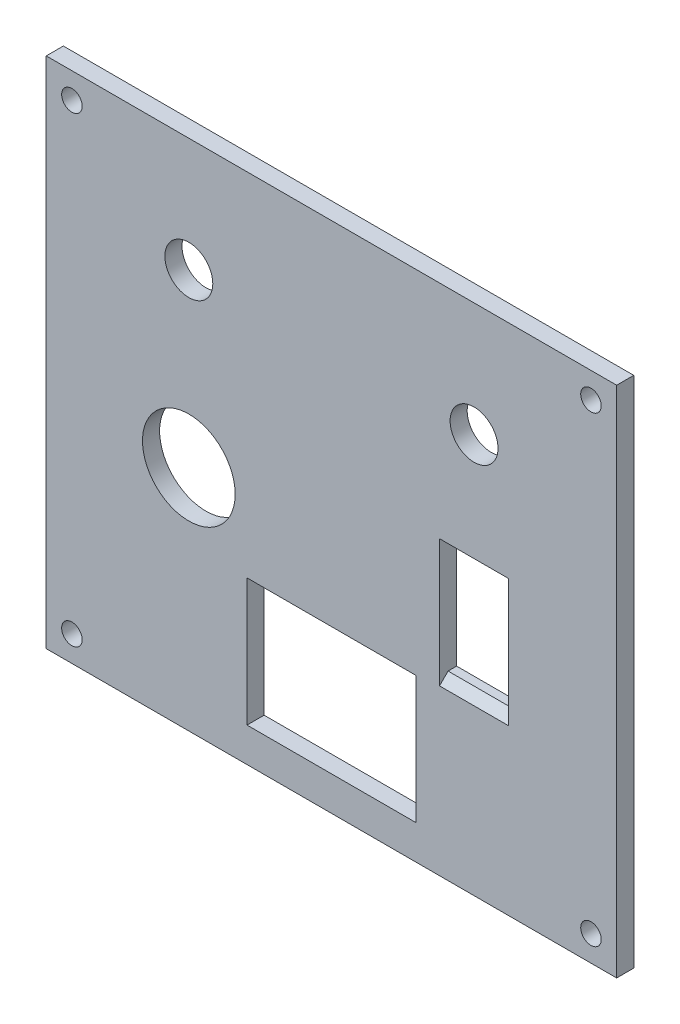
ISO-10303-21;
HEADER;
FILE_DESCRIPTION(('STEP AP214'),'2;1');
FILE_NAME('part.step','',(''),(''),'','','');
FILE_SCHEMA(('AUTOMOTIVE_DESIGN { 1 0 10303 214 1 1 1 1 }'));
ENDSEC;
DATA;
#1=APPLICATION_CONTEXT('core data for automotive mechanical design processes');
#2=APPLICATION_PROTOCOL_DEFINITION('international standard','automotive_design',2000,#1);
#3=PRODUCT_CONTEXT('',#1,'mechanical');
#4=PRODUCT('Part','Part','',(#3));
#5=PRODUCT_RELATED_PRODUCT_CATEGORY('part','',(#4));
#6=PRODUCT_DEFINITION_FORMATION('','',#4);
#7=PRODUCT_DEFINITION_CONTEXT('part definition',#1,'design');
#8=PRODUCT_DEFINITION('design','',#6,#7);
#9=PRODUCT_DEFINITION_SHAPE('','',#8);
#10=(LENGTH_UNIT() NAMED_UNIT(*) SI_UNIT(.MILLI.,.METRE.));
#11=(NAMED_UNIT(*) PLANE_ANGLE_UNIT() SI_UNIT($,.RADIAN.));
#12=(NAMED_UNIT(*) SI_UNIT($,.STERADIAN.) SOLID_ANGLE_UNIT());
#13=UNCERTAINTY_MEASURE_WITH_UNIT(LENGTH_MEASURE(1.E-05),#10,'distance_accuracy_value','');
#14=(GEOMETRIC_REPRESENTATION_CONTEXT(3) GLOBAL_UNCERTAINTY_ASSIGNED_CONTEXT((#13)) GLOBAL_UNIT_ASSIGNED_CONTEXT((#10,
#11,#12)) REPRESENTATION_CONTEXT('',''));
#15=CARTESIAN_POINT('',(0.,0.,0.));
#16=DIRECTION('',(0.,0.,1.));
#17=DIRECTION('',(1.,0.,0.));
#18=AXIS2_PLACEMENT_3D('',#15,#16,#17);
#19=CARTESIAN_POINT('',(0.,0.,3.));
#20=DIRECTION('',(0.,0.,-1.));
#21=DIRECTION('',(-1.,0.,0.));
#22=AXIS2_PLACEMENT_3D('',#19,#20,#21);
#23=PLANE('',#22);
#24=CARTESIAN_POINT('',(45.5,-40.5,3.));
#25=DIRECTION('',(0.,0.,1.));
#26=DIRECTION('',(1.,0.,0.));
#27=AXIS2_PLACEMENT_3D('',#24,#25,#26);
#28=CIRCLE('',#27,1.8);
#29=CARTESIAN_POINT('',(47.3,-40.5,3.));
#30=VERTEX_POINT('',#29);
#31=EDGE_CURVE('E302',#30,#30,#28,.T.);
#32=ORIENTED_EDGE('',*,*,#31,.F.);
#33=EDGE_LOOP('',(#32));
#34=FACE_BOUND('',#33,.T.);
#35=CARTESIAN_POINT('',(-25.,25.0000000000002,3.));
#36=DIRECTION('',(0.,0.,1.));
#37=DIRECTION('',(1.,0.,0.));
#38=AXIS2_PLACEMENT_3D('',#35,#36,#37);
#39=CIRCLE('',#38,4.2);
#40=CARTESIAN_POINT('',(-20.8,25.0000000000002,3.));
#41=VERTEX_POINT('',#40);
#42=EDGE_CURVE('E185',#41,#41,#39,.T.);
#43=ORIENTED_EDGE('',*,*,#42,.F.);
#44=EDGE_LOOP('',(#43));
#45=FACE_BOUND('',#44,.T.);
#46=CARTESIAN_POINT('',(25.,25.,3.));
#47=DIRECTION('',(0.,0.,1.));
#48=DIRECTION('',(1.,0.,0.));
#49=AXIS2_PLACEMENT_3D('',#46,#47,#48);
#50=CIRCLE('',#49,4.2);
#51=CARTESIAN_POINT('',(29.2,25.,3.));
#52=VERTEX_POINT('',#51);
#53=EDGE_CURVE('E191',#52,#52,#50,.T.);
#54=ORIENTED_EDGE('',*,*,#53,.F.);
#55=EDGE_LOOP('',(#54));
#56=FACE_BOUND('',#55,.T.);
#57=CARTESIAN_POINT('',(-25.,-4.99999999999982,3.));
#58=DIRECTION('',(0.,0.,1.));
#59=DIRECTION('',(1.,0.,0.));
#60=AXIS2_PLACEMENT_3D('',#57,#58,#59);
#61=CIRCLE('',#60,8.12500000000001);
#62=CARTESIAN_POINT('',(-16.875,-4.99999999999982,3.));
#63=VERTEX_POINT('',#62);
#64=EDGE_CURVE('E197',#63,#63,#61,.T.);
#65=ORIENTED_EDGE('',*,*,#64,.F.);
#66=EDGE_LOOP('',(#65));
#67=FACE_BOUND('',#66,.T.);
#68=DIRECTION('',(0.,1.,0.));
#69=VECTOR('',#68,1.);
#70=CARTESIAN_POINT('',(14.8,-39.,3.));
#71=LINE('',#70,#69);
#72=CARTESIAN_POINT('',(14.8,-39.,3.));
#73=VERTEX_POINT('',#72);
#74=CARTESIAN_POINT('',(14.8,-16.65,3.));
#75=VERTEX_POINT('',#74);
#76=EDGE_CURVE('E203',#73,#75,#71,.T.);
#77=ORIENTED_EDGE('',*,*,#76,.F.);
#78=DIRECTION('',(1.,0.,0.));
#79=VECTOR('',#78,1.);
#80=CARTESIAN_POINT('',(-14.8,-39.,3.));
#81=LINE('',#80,#79);
#82=CARTESIAN_POINT('',(-14.8,-39.,3.));
#83=VERTEX_POINT('',#82);
#84=EDGE_CURVE('E211',#83,#73,#81,.T.);
#85=ORIENTED_EDGE('',*,*,#84,.F.);
#86=DIRECTION('',(0.,-1.,0.));
#87=VECTOR('',#86,1.);
#88=CARTESIAN_POINT('',(-14.8,-39.,3.));
#89=LINE('',#88,#87);
#90=CARTESIAN_POINT('',(-14.8,-16.65,3.));
#91=VERTEX_POINT('',#90);
#92=EDGE_CURVE('E208',#91,#83,#89,.T.);
#93=ORIENTED_EDGE('',*,*,#92,.F.);
#94=DIRECTION('',(-1.,0.,0.));
#95=VECTOR('',#94,1.);
#96=CARTESIAN_POINT('',(-14.8,-16.65,3.));
#97=LINE('',#96,#95);
#98=EDGE_CURVE('E205',#75,#91,#97,.T.);
#99=ORIENTED_EDGE('',*,*,#98,.F.);
#100=EDGE_LOOP('',(#77,#85,#93,#99));
#101=FACE_BOUND('',#100,.T.);
#102=DIRECTION('',(0.,1.,0.));
#103=VECTOR('',#102,1.);
#104=CARTESIAN_POINT('',(50.,-45.,3.));
#105=LINE('',#104,#103);
#106=CARTESIAN_POINT('',(50.,-45.,3.));
#107=VERTEX_POINT('',#106);
#108=CARTESIAN_POINT('',(50.,45.,3.));
#109=VERTEX_POINT('',#108);
#110=EDGE_CURVE('E234',#107,#109,#105,.T.);
#111=ORIENTED_EDGE('',*,*,#110,.T.);
#112=DIRECTION('',(-1.,0.,0.));
#113=VECTOR('',#112,1.);
#114=CARTESIAN_POINT('',(-50.,45.,3.));
#115=LINE('',#114,#113);
#116=CARTESIAN_POINT('',(-50.,45.,3.));
#117=VERTEX_POINT('',#116);
#118=EDGE_CURVE('E237',#109,#117,#115,.T.);
#119=ORIENTED_EDGE('',*,*,#118,.T.);
#120=DIRECTION('',(0.,-1.,0.));
#121=VECTOR('',#120,1.);
#122=CARTESIAN_POINT('',(-50.,-45.,3.));
#123=LINE('',#122,#121);
#124=CARTESIAN_POINT('',(-50.,-45.,3.));
#125=VERTEX_POINT('',#124);
#126=EDGE_CURVE('E240',#117,#125,#123,.T.);
#127=ORIENTED_EDGE('',*,*,#126,.T.);
#128=DIRECTION('',(1.,0.,0.));
#129=VECTOR('',#128,1.);
#130=CARTESIAN_POINT('',(-50.,-45.,3.));
#131=LINE('',#130,#129);
#132=EDGE_CURVE('E242',#125,#107,#131,.T.);
#133=ORIENTED_EDGE('',*,*,#132,.T.);
#134=EDGE_LOOP('',(#111,#119,#127,#133));
#135=FACE_BOUND('',#134,.T.);
#136=DIRECTION('',(0.,1.,0.));
#137=VECTOR('',#136,1.);
#138=CARTESIAN_POINT('',(31.05,-14.6749999999998,3.));
#139=LINE('',#138,#137);
#140=CARTESIAN_POINT('',(31.05,-16.1749999999998,3.));
#141=VERTEX_POINT('',#140);
#142=CARTESIAN_POINT('',(31.05,6.1750000000002,3.));
#143=VERTEX_POINT('',#142);
#144=EDGE_CURVE('E179',#141,#143,#139,.T.);
#145=ORIENTED_EDGE('',*,*,#144,.F.);
#146=DIRECTION('',(-1.,0.,0.));
#147=VECTOR('',#146,1.);
#148=CARTESIAN_POINT('',(18.95,-16.1749999999998,3.));
#149=LINE('',#148,#147);
#150=CARTESIAN_POINT('',(18.95,-16.1749999999998,3.));
#151=VERTEX_POINT('',#150);
#152=EDGE_CURVE('E269',#141,#151,#149,.T.);
#153=ORIENTED_EDGE('',*,*,#152,.T.);
#154=DIRECTION('',(0.,-1.,0.));
#155=VECTOR('',#154,1.);
#156=CARTESIAN_POINT('',(18.95,-14.6749999999998,3.));
#157=LINE('',#156,#155);
#158=CARTESIAN_POINT('',(18.95,6.1750000000002,3.));
#159=VERTEX_POINT('',#158);
#160=EDGE_CURVE('E174',#159,#151,#157,.T.);
#161=ORIENTED_EDGE('',*,*,#160,.F.);
#162=DIRECTION('',(1.,0.,0.));
#163=VECTOR('',#162,1.);
#164=CARTESIAN_POINT('',(31.05,6.1750000000002,3.));
#165=LINE('',#164,#163);
#166=EDGE_CURVE('E266',#159,#143,#165,.T.);
#167=ORIENTED_EDGE('',*,*,#166,.T.);
#168=EDGE_LOOP('',(#145,#153,#161,#167));
#169=FACE_BOUND('',#168,.T.);
#170=CARTESIAN_POINT('',(-45.5,40.5,3.));
#171=DIRECTION('',(0.,0.,1.));
#172=DIRECTION('',(1.,0.,0.));
#173=AXIS2_PLACEMENT_3D('',#170,#171,#172);
#174=CIRCLE('',#173,1.8);
#175=CARTESIAN_POINT('',(-43.7,40.5,3.));
#176=VERTEX_POINT('',#175);
#177=EDGE_CURVE('E171',#176,#176,#174,.T.);
#178=ORIENTED_EDGE('',*,*,#177,.F.);
#179=EDGE_LOOP('',(#178));
#180=FACE_BOUND('',#179,.T.);
#181=CARTESIAN_POINT('',(-45.5,-40.5,3.));
#182=DIRECTION('',(0.,0.,1.));
#183=DIRECTION('',(1.,0.,0.));
#184=AXIS2_PLACEMENT_3D('',#181,#182,#183);
#185=CIRCLE('',#184,1.8);
#186=CARTESIAN_POINT('',(-43.7,-40.5,3.));
#187=VERTEX_POINT('',#186);
#188=EDGE_CURVE('E290',#187,#187,#185,.T.);
#189=ORIENTED_EDGE('',*,*,#188,.F.);
#190=EDGE_LOOP('',(#189));
#191=FACE_BOUND('',#190,.T.);
#192=CARTESIAN_POINT('',(45.5,40.5,3.));
#193=DIRECTION('',(0.,0.,1.));
#194=DIRECTION('',(1.,0.,0.));
#195=AXIS2_PLACEMENT_3D('',#192,#193,#194);
#196=CIRCLE('',#195,1.8);
#197=CARTESIAN_POINT('',(47.3,40.5,3.));
#198=VERTEX_POINT('',#197);
#199=EDGE_CURVE('E296',#198,#198,#196,.T.);
#200=ORIENTED_EDGE('',*,*,#199,.F.);
#201=EDGE_LOOP('',(#200));
#202=FACE_BOUND('',#201,.T.);
#203=ADVANCED_FACE('F46',(#34,#45,#56,#67,#101,#135,#169,#180,#191,#202),#23,.F.);
#204=CARTESIAN_POINT('',(0.,0.,0.));
#205=DIRECTION('',(0.,0.,-1.));
#206=DIRECTION('',(-1.,0.,0.));
#207=AXIS2_PLACEMENT_3D('',#204,#205,#206);
#208=PLANE('',#207);
#209=CARTESIAN_POINT('',(45.5,-40.5,0.));
#210=DIRECTION('',(0.,0.,-1.));
#211=DIRECTION('',(-1.,0.,0.));
#212=AXIS2_PLACEMENT_3D('',#209,#210,#211);
#213=CIRCLE('',#212,1.8);
#214=CARTESIAN_POINT('',(43.7,-40.5,0.));
#215=VERTEX_POINT('',#214);
#216=EDGE_CURVE('E299',#215,#215,#213,.T.);
#217=ORIENTED_EDGE('',*,*,#216,.F.);
#218=EDGE_LOOP('',(#217));
#219=FACE_BOUND('',#218,.T.);
#220=CARTESIAN_POINT('',(45.5,40.5,0.));
#221=DIRECTION('',(0.,0.,-1.));
#222=DIRECTION('',(-1.,0.,0.));
#223=AXIS2_PLACEMENT_3D('',#220,#221,#222);
#224=CIRCLE('',#223,1.8);
#225=CARTESIAN_POINT('',(43.7,40.5,0.));
#226=VERTEX_POINT('',#225);
#227=EDGE_CURVE('E293',#226,#226,#224,.T.);
#228=ORIENTED_EDGE('',*,*,#227,.F.);
#229=EDGE_LOOP('',(#228));
#230=FACE_BOUND('',#229,.T.);
#231=CARTESIAN_POINT('',(-45.5,-40.5,0.));
#232=DIRECTION('',(0.,0.,-1.));
#233=DIRECTION('',(-1.,0.,0.));
#234=AXIS2_PLACEMENT_3D('',#231,#232,#233);
#235=CIRCLE('',#234,1.8);
#236=CARTESIAN_POINT('',(-47.3,-40.5,0.));
#237=VERTEX_POINT('',#236);
#238=EDGE_CURVE('E287',#237,#237,#235,.T.);
#239=ORIENTED_EDGE('',*,*,#238,.F.);
#240=EDGE_LOOP('',(#239));
#241=FACE_BOUND('',#240,.T.);
#242=CARTESIAN_POINT('',(-45.5,40.5,0.));
#243=DIRECTION('',(0.,0.,-1.));
#244=DIRECTION('',(-1.,0.,0.));
#245=AXIS2_PLACEMENT_3D('',#242,#243,#244);
#246=CIRCLE('',#245,1.8);
#247=CARTESIAN_POINT('',(-47.3,40.5,0.));
#248=VERTEX_POINT('',#247);
#249=EDGE_CURVE('E168',#248,#248,#246,.T.);
#250=ORIENTED_EDGE('',*,*,#249,.F.);
#251=EDGE_LOOP('',(#250));
#252=FACE_BOUND('',#251,.T.);
#253=CARTESIAN_POINT('',(25.,25.,0.));
#254=DIRECTION('',(0.,0.,1.));
#255=DIRECTION('',(1.,0.,0.));
#256=AXIS2_PLACEMENT_3D('',#253,#254,#255);
#257=CIRCLE('',#256,4.2);
#258=CARTESIAN_POINT('',(29.2,25.,0.));
#259=VERTEX_POINT('',#258);
#260=EDGE_CURVE('E188',#259,#259,#257,.T.);
#261=ORIENTED_EDGE('',*,*,#260,.T.);
#262=EDGE_LOOP('',(#261));
#263=FACE_BOUND('',#262,.T.);
#264=DIRECTION('',(1.,0.,0.));
#265=VECTOR('',#264,1.);
#266=CARTESIAN_POINT('',(-14.8,-39.,0.));
#267=LINE('',#266,#265);
#268=CARTESIAN_POINT('',(-14.8,-39.,0.));
#269=VERTEX_POINT('',#268);
#270=CARTESIAN_POINT('',(14.8,-39.,0.));
#271=VERTEX_POINT('',#270);
#272=EDGE_CURVE('E206',#269,#271,#267,.T.);
#273=ORIENTED_EDGE('',*,*,#272,.T.);
#274=DIRECTION('',(0.,1.,0.));
#275=VECTOR('',#274,1.);
#276=CARTESIAN_POINT('',(14.8,-39.,0.));
#277=LINE('',#276,#275);
#278=CARTESIAN_POINT('',(14.8,-16.65,0.));
#279=VERTEX_POINT('',#278);
#280=EDGE_CURVE('E200',#271,#279,#277,.T.);
#281=ORIENTED_EDGE('',*,*,#280,.T.);
#282=DIRECTION('',(-1.,0.,0.));
#283=VECTOR('',#282,1.);
#284=CARTESIAN_POINT('',(-14.8,-16.65,0.));
#285=LINE('',#284,#283);
#286=CARTESIAN_POINT('',(-14.8,-16.65,0.));
#287=VERTEX_POINT('',#286);
#288=EDGE_CURVE('E216',#279,#287,#285,.T.);
#289=ORIENTED_EDGE('',*,*,#288,.T.);
#290=DIRECTION('',(0.,-1.,0.));
#291=VECTOR('',#290,1.);
#292=CARTESIAN_POINT('',(-14.8,-39.,0.));
#293=LINE('',#292,#291);
#294=EDGE_CURVE('E219',#287,#269,#293,.T.);
#295=ORIENTED_EDGE('',*,*,#294,.T.);
#296=EDGE_LOOP('',(#273,#281,#289,#295));
#297=FACE_BOUND('',#296,.T.);
#298=DIRECTION('',(0.,1.,0.));
#299=VECTOR('',#298,1.);
#300=CARTESIAN_POINT('',(50.,-45.,0.));
#301=LINE('',#300,#299);
#302=CARTESIAN_POINT('',(50.,-45.,0.));
#303=VERTEX_POINT('',#302);
#304=CARTESIAN_POINT('',(50.,45.,0.));
#305=VERTEX_POINT('',#304);
#306=EDGE_CURVE('E233',#303,#305,#301,.T.);
#307=ORIENTED_EDGE('',*,*,#306,.F.);
#308=DIRECTION('',(1.,0.,0.));
#309=VECTOR('',#308,1.);
#310=CARTESIAN_POINT('',(-50.,-45.,0.));
#311=LINE('',#310,#309);
#312=CARTESIAN_POINT('',(-50.,-45.,0.));
#313=VERTEX_POINT('',#312);
#314=EDGE_CURVE('E238',#313,#303,#311,.T.);
#315=ORIENTED_EDGE('',*,*,#314,.F.);
#316=DIRECTION('',(0.,-1.,0.));
#317=VECTOR('',#316,1.);
#318=CARTESIAN_POINT('',(-50.,-45.,0.));
#319=LINE('',#318,#317);
#320=CARTESIAN_POINT('',(-50.,45.,0.));
#321=VERTEX_POINT('',#320);
#322=EDGE_CURVE('E249',#321,#313,#319,.T.);
#323=ORIENTED_EDGE('',*,*,#322,.F.);
#324=DIRECTION('',(-1.,0.,0.));
#325=VECTOR('',#324,1.);
#326=CARTESIAN_POINT('',(-50.,45.,0.));
#327=LINE('',#326,#325);
#328=EDGE_CURVE('E247',#305,#321,#327,.T.);
#329=ORIENTED_EDGE('',*,*,#328,.F.);
#330=EDGE_LOOP('',(#307,#315,#323,#329));
#331=FACE_BOUND('',#330,.T.);
#332=CARTESIAN_POINT('',(-25.,-4.99999999999982,0.));
#333=DIRECTION('',(0.,0.,1.));
#334=DIRECTION('',(1.,0.,0.));
#335=AXIS2_PLACEMENT_3D('',#332,#333,#334);
#336=CIRCLE('',#335,8.12500000000001);
#337=CARTESIAN_POINT('',(-16.875,-4.99999999999982,0.));
#338=VERTEX_POINT('',#337);
#339=EDGE_CURVE('E194',#338,#338,#336,.T.);
#340=ORIENTED_EDGE('',*,*,#339,.T.);
#341=EDGE_LOOP('',(#340));
#342=FACE_BOUND('',#341,.T.);
#343=CARTESIAN_POINT('',(-25.,25.0000000000002,0.));
#344=DIRECTION('',(0.,0.,1.));
#345=DIRECTION('',(1.,0.,0.));
#346=AXIS2_PLACEMENT_3D('',#343,#344,#345);
#347=CIRCLE('',#346,4.2);
#348=CARTESIAN_POINT('',(-20.8,25.0000000000002,0.));
#349=VERTEX_POINT('',#348);
#350=EDGE_CURVE('E153',#349,#349,#347,.T.);
#351=ORIENTED_EDGE('',*,*,#350,.T.);
#352=EDGE_LOOP('',(#351));
#353=FACE_BOUND('',#352,.T.);
#354=DIRECTION('',(1.,0.,0.));
#355=VECTOR('',#354,1.);
#356=CARTESIAN_POINT('',(18.95,-14.6749999999998,0.));
#357=LINE('',#356,#355);
#358=CARTESIAN_POINT('',(18.95,-14.6749999999998,0.));
#359=VERTEX_POINT('',#358);
#360=CARTESIAN_POINT('',(31.05,-14.6749999999998,0.));
#361=VERTEX_POINT('',#360);
#362=EDGE_CURVE('E167',#359,#361,#357,.T.);
#363=ORIENTED_EDGE('',*,*,#362,.T.);
#364=DIRECTION('',(0.,1.,0.));
#365=VECTOR('',#364,1.);
#366=CARTESIAN_POINT('',(31.05,-14.6749999999998,0.));
#367=LINE('',#366,#365);
#368=CARTESIAN_POINT('',(31.05,4.67500000000018,0.));
#369=VERTEX_POINT('',#368);
#370=EDGE_CURVE('E150',#361,#369,#367,.T.);
#371=ORIENTED_EDGE('',*,*,#370,.T.);
#372=DIRECTION('',(-1.,0.,0.));
#373=VECTOR('',#372,1.);
#374=CARTESIAN_POINT('',(18.95,4.67500000000018,0.));
#375=LINE('',#374,#373);
#376=CARTESIAN_POINT('',(18.95,4.67500000000018,0.));
#377=VERTEX_POINT('',#376);
#378=EDGE_CURVE('E157',#369,#377,#375,.T.);
#379=ORIENTED_EDGE('',*,*,#378,.T.);
#380=DIRECTION('',(0.,-1.,0.));
#381=VECTOR('',#380,1.);
#382=CARTESIAN_POINT('',(18.95,-14.6749999999998,0.));
#383=LINE('',#382,#381);
#384=EDGE_CURVE('E163',#377,#359,#383,.T.);
#385=ORIENTED_EDGE('',*,*,#384,.T.);
#386=EDGE_LOOP('',(#363,#371,#379,#385));
#387=FACE_BOUND('',#386,.T.);
#388=ADVANCED_FACE('F165',(#219,#230,#241,#252,#263,#297,#331,#342,#353,#387),#208,.T.);
#389=CARTESIAN_POINT('',(50.,-45.,3.));
#390=DIRECTION('',(-1.,0.,0.));
#391=DIRECTION('',(0.,0.,1.));
#392=AXIS2_PLACEMENT_3D('',#389,#390,#391);
#393=PLANE('',#392);
#394=ORIENTED_EDGE('',*,*,#306,.T.);
#395=DIRECTION('',(0.,0.,-1.));
#396=VECTOR('',#395,1.);
#397=CARTESIAN_POINT('',(50.,45.,3.));
#398=LINE('',#397,#396);
#399=EDGE_CURVE('E260',#109,#305,#398,.T.);
#400=ORIENTED_EDGE('',*,*,#399,.F.);
#401=ORIENTED_EDGE('',*,*,#110,.F.);
#402=DIRECTION('',(0.,0.,-1.));
#403=VECTOR('',#402,1.);
#404=CARTESIAN_POINT('',(50.,-45.,3.));
#405=LINE('',#404,#403);
#406=EDGE_CURVE('E244',#107,#303,#405,.T.);
#407=ORIENTED_EDGE('',*,*,#406,.T.);
#408=EDGE_LOOP('',(#394,#400,#401,#407));
#409=FACE_BOUND('',#408,.T.);
#410=ADVANCED_FACE('F328',(#409),#393,.F.);
#411=CARTESIAN_POINT('',(-50.,45.,3.));
#412=DIRECTION('',(0.,-1.,0.));
#413=DIRECTION('',(0.,0.,-1.));
#414=AXIS2_PLACEMENT_3D('',#411,#412,#413);
#415=PLANE('',#414);
#416=ORIENTED_EDGE('',*,*,#328,.T.);
#417=DIRECTION('',(0.,0.,-1.));
#418=VECTOR('',#417,1.);
#419=CARTESIAN_POINT('',(-50.,45.,3.));
#420=LINE('',#419,#418);
#421=EDGE_CURVE('E257',#117,#321,#420,.T.);
#422=ORIENTED_EDGE('',*,*,#421,.F.);
#423=ORIENTED_EDGE('',*,*,#118,.F.);
#424=ORIENTED_EDGE('',*,*,#399,.T.);
#425=EDGE_LOOP('',(#416,#422,#423,#424));
#426=FACE_BOUND('',#425,.T.);
#427=ADVANCED_FACE('F331',(#426),#415,.F.);
#428=CARTESIAN_POINT('',(-50.,-45.,3.));
#429=DIRECTION('',(1.,0.,0.));
#430=DIRECTION('',(0.,0.,-1.));
#431=AXIS2_PLACEMENT_3D('',#428,#429,#430);
#432=PLANE('',#431);
#433=ORIENTED_EDGE('',*,*,#322,.T.);
#434=DIRECTION('',(0.,0.,-1.));
#435=VECTOR('',#434,1.);
#436=CARTESIAN_POINT('',(-50.,-45.,3.));
#437=LINE('',#436,#435);
#438=EDGE_CURVE('E254',#125,#313,#437,.T.);
#439=ORIENTED_EDGE('',*,*,#438,.F.);
#440=ORIENTED_EDGE('',*,*,#126,.F.);
#441=ORIENTED_EDGE('',*,*,#421,.T.);
#442=EDGE_LOOP('',(#433,#439,#440,#441));
#443=FACE_BOUND('',#442,.T.);
#444=ADVANCED_FACE('F336',(#443),#432,.F.);
#445=CARTESIAN_POINT('',(-50.,-45.,3.));
#446=DIRECTION('',(0.,1.,0.));
#447=DIRECTION('',(0.,0.,1.));
#448=AXIS2_PLACEMENT_3D('',#445,#446,#447);
#449=PLANE('',#448);
#450=ORIENTED_EDGE('',*,*,#314,.T.);
#451=ORIENTED_EDGE('',*,*,#406,.F.);
#452=ORIENTED_EDGE('',*,*,#132,.F.);
#453=ORIENTED_EDGE('',*,*,#438,.T.);
#454=EDGE_LOOP('',(#450,#451,#452,#453));
#455=FACE_BOUND('',#454,.T.);
#456=ADVANCED_FACE('F339',(#455),#449,.F.);
#457=CARTESIAN_POINT('',(14.8,-39.,3.));
#458=DIRECTION('',(-1.,0.,0.));
#459=DIRECTION('',(0.,-1.,0.));
#460=AXIS2_PLACEMENT_3D('',#457,#458,#459);
#461=PLANE('',#460);
#462=ORIENTED_EDGE('',*,*,#280,.F.);
#463=DIRECTION('',(0.,0.,-1.));
#464=VECTOR('',#463,1.);
#465=CARTESIAN_POINT('',(14.8,-39.,3.));
#466=LINE('',#465,#464);
#467=EDGE_CURVE('E213',#73,#271,#466,.T.);
#468=ORIENTED_EDGE('',*,*,#467,.F.);
#469=ORIENTED_EDGE('',*,*,#76,.T.);
#470=DIRECTION('',(0.,0.,-1.));
#471=VECTOR('',#470,1.);
#472=CARTESIAN_POINT('',(14.8,-16.65,3.));
#473=LINE('',#472,#471);
#474=EDGE_CURVE('E230',#75,#279,#473,.T.);
#475=ORIENTED_EDGE('',*,*,#474,.T.);
#476=EDGE_LOOP('',(#462,#468,#469,#475));
#477=FACE_BOUND('',#476,.T.);
#478=ADVANCED_FACE('F378',(#477),#461,.T.);
#479=CARTESIAN_POINT('',(-14.8,-16.65,3.));
#480=DIRECTION('',(0.,-1.,0.));
#481=DIRECTION('',(1.,0.,0.));
#482=AXIS2_PLACEMENT_3D('',#479,#480,#481);
#483=PLANE('',#482);
#484=ORIENTED_EDGE('',*,*,#288,.F.);
#485=ORIENTED_EDGE('',*,*,#474,.F.);
#486=ORIENTED_EDGE('',*,*,#98,.T.);
#487=DIRECTION('',(0.,0.,-1.));
#488=VECTOR('',#487,1.);
#489=CARTESIAN_POINT('',(-14.8,-16.65,3.));
#490=LINE('',#489,#488);
#491=EDGE_CURVE('E228',#91,#287,#490,.T.);
#492=ORIENTED_EDGE('',*,*,#491,.T.);
#493=EDGE_LOOP('',(#484,#485,#486,#492));
#494=FACE_BOUND('',#493,.T.);
#495=ADVANCED_FACE('F374',(#494),#483,.T.);
#496=CARTESIAN_POINT('',(-14.8,-39.,3.));
#497=DIRECTION('',(1.,0.,0.));
#498=DIRECTION('',(0.,0.,-1.));
#499=AXIS2_PLACEMENT_3D('',#496,#497,#498);
#500=PLANE('',#499);
#501=ORIENTED_EDGE('',*,*,#294,.F.);
#502=ORIENTED_EDGE('',*,*,#491,.F.);
#503=ORIENTED_EDGE('',*,*,#92,.T.);
#504=DIRECTION('',(0.,0.,-1.));
#505=VECTOR('',#504,1.);
#506=CARTESIAN_POINT('',(-14.8,-39.,3.));
#507=LINE('',#506,#505);
#508=EDGE_CURVE('E226',#83,#269,#507,.T.);
#509=ORIENTED_EDGE('',*,*,#508,.T.);
#510=EDGE_LOOP('',(#501,#502,#503,#509));
#511=FACE_BOUND('',#510,.T.);
#512=ADVANCED_FACE('F370',(#511),#500,.T.);
#513=CARTESIAN_POINT('',(-14.8,-39.,3.));
#514=DIRECTION('',(0.,1.,0.));
#515=DIRECTION('',(0.,0.,1.));
#516=AXIS2_PLACEMENT_3D('',#513,#514,#515);
#517=PLANE('',#516);
#518=ORIENTED_EDGE('',*,*,#272,.F.);
#519=ORIENTED_EDGE('',*,*,#508,.F.);
#520=ORIENTED_EDGE('',*,*,#84,.T.);
#521=ORIENTED_EDGE('',*,*,#467,.T.);
#522=EDGE_LOOP('',(#518,#519,#520,#521));
#523=FACE_BOUND('',#522,.T.);
#524=ADVANCED_FACE('F366',(#523),#517,.T.);
#525=CARTESIAN_POINT('',(-25.,-4.99999999999982,3.));
#526=DIRECTION('',(0.,0.,-1.));
#527=DIRECTION('',(-1.,0.,0.));
#528=AXIS2_PLACEMENT_3D('',#525,#526,#527);
#529=CYLINDRICAL_SURFACE('',#528,8.12500000000001);
#530=ORIENTED_EDGE('',*,*,#64,.T.);
#531=EDGE_LOOP('',(#530));
#532=FACE_BOUND('',#531,.T.);
#533=ORIENTED_EDGE('',*,*,#339,.F.);
#534=EDGE_LOOP('',(#533));
#535=FACE_BOUND('',#534,.T.);
#536=ADVANCED_FACE('F359',(#532,#535),#529,.F.);
#537=CARTESIAN_POINT('',(25.,25.,3.));
#538=DIRECTION('',(0.,0.,-1.));
#539=DIRECTION('',(-1.,0.,0.));
#540=AXIS2_PLACEMENT_3D('',#537,#538,#539);
#541=CYLINDRICAL_SURFACE('',#540,4.2);
#542=ORIENTED_EDGE('',*,*,#53,.T.);
#543=EDGE_LOOP('',(#542));
#544=FACE_BOUND('',#543,.T.);
#545=ORIENTED_EDGE('',*,*,#260,.F.);
#546=EDGE_LOOP('',(#545));
#547=FACE_BOUND('',#546,.T.);
#548=ADVANCED_FACE('F351',(#544,#547),#541,.F.);
#549=CARTESIAN_POINT('',(-25.,25.0000000000002,3.));
#550=DIRECTION('',(0.,0.,-1.));
#551=DIRECTION('',(-1.,0.,0.));
#552=AXIS2_PLACEMENT_3D('',#549,#550,#551);
#553=CYLINDRICAL_SURFACE('',#552,4.2);
#554=ORIENTED_EDGE('',*,*,#42,.T.);
#555=EDGE_LOOP('',(#554));
#556=FACE_BOUND('',#555,.T.);
#557=ORIENTED_EDGE('',*,*,#350,.F.);
#558=EDGE_LOOP('',(#557));
#559=FACE_BOUND('',#558,.T.);
#560=ADVANCED_FACE('F349',(#556,#559),#553,.F.);
#561=CARTESIAN_POINT('',(31.05,-14.6749999999998,3.));
#562=DIRECTION('',(-1.,0.,0.));
#563=DIRECTION('',(0.,0.,1.));
#564=AXIS2_PLACEMENT_3D('',#561,#562,#563);
#565=PLANE('',#564);
#566=ORIENTED_EDGE('',*,*,#370,.F.);
#567=DIRECTION('',(0.,0.,-1.));
#568=VECTOR('',#567,1.);
#569=CARTESIAN_POINT('',(31.05,-14.6749999999998,3.));
#570=LINE('',#569,#568);
#571=CARTESIAN_POINT('',(31.05,-14.6749999999998,1.5));
#572=VERTEX_POINT('',#571);
#573=EDGE_CURVE('E180',#572,#361,#570,.T.);
#574=ORIENTED_EDGE('',*,*,#573,.F.);
#575=DIRECTION('',(0.,-0.707106781186551,0.707106781186544));
#576=VECTOR('',#575,1.);
#577=CARTESIAN_POINT('',(31.05,-14.6749999999998,1.5));
#578=LINE('',#577,#576);
#579=EDGE_CURVE('E274',#572,#141,#578,.T.);
#580=ORIENTED_EDGE('',*,*,#579,.T.);
#581=ORIENTED_EDGE('',*,*,#144,.T.);
#582=DIRECTION('',(0.,-0.707106781186551,-0.707106781186544));
#583=VECTOR('',#582,1.);
#584=CARTESIAN_POINT('',(31.05,4.67500000000018,1.5));
#585=LINE('',#584,#583);
#586=CARTESIAN_POINT('',(31.05,4.67500000000018,1.5));
#587=VERTEX_POINT('',#586);
#588=EDGE_CURVE('E11',#143,#587,#585,.T.);
#589=ORIENTED_EDGE('',*,*,#588,.T.);
#590=DIRECTION('',(0.,0.,-1.));
#591=VECTOR('',#590,1.);
#592=CARTESIAN_POINT('',(31.05,4.67500000000018,3.));
#593=LINE('',#592,#591);
#594=EDGE_CURVE('E145',#587,#369,#593,.T.);
#595=ORIENTED_EDGE('',*,*,#594,.T.);
#596=EDGE_LOOP('',(#566,#574,#580,#581,#589,#595));
#597=FACE_BOUND('',#596,.T.);
#598=ADVANCED_FACE('F147',(#597),#565,.T.);
#599=CARTESIAN_POINT('',(18.95,4.67500000000018,3.));
#600=DIRECTION('',(0.,-1.,0.));
#601=DIRECTION('',(1.,0.,0.));
#602=AXIS2_PLACEMENT_3D('',#599,#600,#601);
#603=PLANE('',#602);
#604=ORIENTED_EDGE('',*,*,#594,.F.);
#605=DIRECTION('',(-1.,0.,0.));
#606=VECTOR('',#605,1.);
#607=CARTESIAN_POINT('',(18.95,4.67500000000018,1.5));
#608=LINE('',#607,#606);
#609=CARTESIAN_POINT('',(18.95,4.67500000000018,1.5));
#610=VERTEX_POINT('',#609);
#611=EDGE_CURVE('E272',#587,#610,#608,.T.);
#612=ORIENTED_EDGE('',*,*,#611,.T.);
#613=DIRECTION('',(0.,0.,-1.));
#614=VECTOR('',#613,1.);
#615=CARTESIAN_POINT('',(18.95,4.67500000000018,3.));
#616=LINE('',#615,#614);
#617=EDGE_CURVE('E154',#610,#377,#616,.T.);
#618=ORIENTED_EDGE('',*,*,#617,.T.);
#619=ORIENTED_EDGE('',*,*,#378,.F.);
#620=EDGE_LOOP('',(#604,#612,#618,#619));
#621=FACE_BOUND('',#620,.T.);
#622=ADVANCED_FACE('F158',(#621),#603,.T.);
#623=CARTESIAN_POINT('',(18.95,-14.6749999999998,3.));
#624=DIRECTION('',(1.,0.,0.));
#625=DIRECTION('',(0.,1.,0.));
#626=AXIS2_PLACEMENT_3D('',#623,#624,#625);
#627=PLANE('',#626);
#628=ORIENTED_EDGE('',*,*,#384,.F.);
#629=ORIENTED_EDGE('',*,*,#617,.F.);
#630=DIRECTION('',(0.,0.707106781186551,0.707106781186544));
#631=VECTOR('',#630,1.);
#632=CARTESIAN_POINT('',(18.95,4.67500000000018,1.5));
#633=LINE('',#632,#631);
#634=EDGE_CURVE('E55',#610,#159,#633,.T.);
#635=ORIENTED_EDGE('',*,*,#634,.T.);
#636=ORIENTED_EDGE('',*,*,#160,.T.);
#637=DIRECTION('',(0.,0.707106781186551,-0.707106781186544));
#638=VECTOR('',#637,1.);
#639=CARTESIAN_POINT('',(18.95,-14.6749999999998,1.5));
#640=LINE('',#639,#638);
#641=CARTESIAN_POINT('',(18.95,-14.6749999999998,1.5));
#642=VERTEX_POINT('',#641);
#643=EDGE_CURVE('E277',#151,#642,#640,.T.);
#644=ORIENTED_EDGE('',*,*,#643,.T.);
#645=DIRECTION('',(0.,0.,-1.));
#646=VECTOR('',#645,1.);
#647=CARTESIAN_POINT('',(18.95,-14.6749999999998,3.));
#648=LINE('',#647,#646);
#649=EDGE_CURVE('E182',#642,#359,#648,.T.);
#650=ORIENTED_EDGE('',*,*,#649,.T.);
#651=EDGE_LOOP('',(#628,#629,#635,#636,#644,#650));
#652=FACE_BOUND('',#651,.T.);
#653=ADVANCED_FACE('F279',(#652),#627,.T.);
#654=CARTESIAN_POINT('',(18.95,-14.6749999999998,3.));
#655=DIRECTION('',(0.,1.,0.));
#656=DIRECTION('',(-1.,0.,0.));
#657=AXIS2_PLACEMENT_3D('',#654,#655,#656);
#658=PLANE('',#657);
#659=ORIENTED_EDGE('',*,*,#649,.F.);
#660=DIRECTION('',(1.,0.,0.));
#661=VECTOR('',#660,1.);
#662=CARTESIAN_POINT('',(31.05,-14.6749999999998,1.5));
#663=LINE('',#662,#661);
#664=EDGE_CURVE('E263',#642,#572,#663,.T.);
#665=ORIENTED_EDGE('',*,*,#664,.T.);
#666=ORIENTED_EDGE('',*,*,#573,.T.);
#667=ORIENTED_EDGE('',*,*,#362,.F.);
#668=EDGE_LOOP('',(#659,#665,#666,#667));
#669=FACE_BOUND('',#668,.T.);
#670=ADVANCED_FACE('F405',(#669),#658,.T.);
#671=CARTESIAN_POINT('',(-45.5,40.5,3.));
#672=DIRECTION('',(0.,0.,1.));
#673=DIRECTION('',(1.,0.,0.));
#674=AXIS2_PLACEMENT_3D('',#671,#672,#673);
#675=CYLINDRICAL_SURFACE('',#674,1.8);
#676=ORIENTED_EDGE('',*,*,#177,.T.);
#677=EDGE_LOOP('',(#676));
#678=FACE_BOUND('',#677,.T.);
#679=ORIENTED_EDGE('',*,*,#249,.T.);
#680=EDGE_LOOP('',(#679));
#681=FACE_BOUND('',#680,.T.);
#682=ADVANCED_FACE('F407',(#678,#681),#675,.F.);
#683=CARTESIAN_POINT('',(-45.5,-40.5,3.));
#684=DIRECTION('',(0.,0.,1.));
#685=DIRECTION('',(1.,0.,0.));
#686=AXIS2_PLACEMENT_3D('',#683,#684,#685);
#687=CYLINDRICAL_SURFACE('',#686,1.8);
#688=ORIENTED_EDGE('',*,*,#188,.T.);
#689=EDGE_LOOP('',(#688));
#690=FACE_BOUND('',#689,.T.);
#691=ORIENTED_EDGE('',*,*,#238,.T.);
#692=EDGE_LOOP('',(#691));
#693=FACE_BOUND('',#692,.T.);
#694=ADVANCED_FACE('F413',(#690,#693),#687,.F.);
#695=CARTESIAN_POINT('',(45.5,40.5,3.));
#696=DIRECTION('',(0.,0.,1.));
#697=DIRECTION('',(1.,0.,0.));
#698=AXIS2_PLACEMENT_3D('',#695,#696,#697);
#699=CYLINDRICAL_SURFACE('',#698,1.8);
#700=ORIENTED_EDGE('',*,*,#199,.T.);
#701=EDGE_LOOP('',(#700));
#702=FACE_BOUND('',#701,.T.);
#703=ORIENTED_EDGE('',*,*,#227,.T.);
#704=EDGE_LOOP('',(#703));
#705=FACE_BOUND('',#704,.T.);
#706=ADVANCED_FACE('F400',(#702,#705),#699,.F.);
#707=CARTESIAN_POINT('',(45.5,-40.5,3.));
#708=DIRECTION('',(0.,0.,1.));
#709=DIRECTION('',(1.,0.,0.));
#710=AXIS2_PLACEMENT_3D('',#707,#708,#709);
#711=CYLINDRICAL_SURFACE('',#710,1.8);
#712=ORIENTED_EDGE('',*,*,#31,.T.);
#713=EDGE_LOOP('',(#712));
#714=FACE_BOUND('',#713,.T.);
#715=ORIENTED_EDGE('',*,*,#216,.T.);
#716=EDGE_LOOP('',(#715));
#717=FACE_BOUND('',#716,.T.);
#718=ADVANCED_FACE('F306',(#714,#717),#711,.F.);
#719=CARTESIAN_POINT('',(18.95,-14.6749999999998,1.5));
#720=DIRECTION('',(0.,0.707106781186544,0.707106781186551));
#721=DIRECTION('',(-1.,0.,0.));
#722=AXIS2_PLACEMENT_3D('',#719,#720,#721);
#723=PLANE('',#722);
#724=ORIENTED_EDGE('',*,*,#643,.F.);
#725=ORIENTED_EDGE('',*,*,#152,.F.);
#726=ORIENTED_EDGE('',*,*,#579,.F.);
#727=ORIENTED_EDGE('',*,*,#664,.F.);
#728=EDGE_LOOP('',(#724,#725,#726,#727));
#729=FACE_BOUND('',#728,.T.);
#730=ADVANCED_FACE('F391',(#729),#723,.T.);
#731=CARTESIAN_POINT('',(18.95,4.67500000000018,1.5));
#732=DIRECTION('',(0.,-0.707106781186544,0.707106781186551));
#733=DIRECTION('',(1.,0.,0.));
#734=AXIS2_PLACEMENT_3D('',#731,#732,#733);
#735=PLANE('',#734);
#736=ORIENTED_EDGE('',*,*,#588,.F.);
#737=ORIENTED_EDGE('',*,*,#166,.F.);
#738=ORIENTED_EDGE('',*,*,#634,.F.);
#739=ORIENTED_EDGE('',*,*,#611,.F.);
#740=EDGE_LOOP('',(#736,#737,#738,#739));
#741=FACE_BOUND('',#740,.T.);
#742=ADVANCED_FACE('F49',(#741),#735,.T.);
#743=CLOSED_SHELL('',(#203,#388,#410,#427,#444,#456,#478,#495,#512,#524,#536,#548,#560,#598,
#622,#653,#670,#682,#694,#706,#718,#730,#742));
#744=MANIFOLD_SOLID_BREP('B2',#743);
#745=ADVANCED_BREP_SHAPE_REPRESENTATION('',(#18,#744),#14);
#746=SHAPE_DEFINITION_REPRESENTATION(#9,#745);
ENDSEC;
END-ISO-10303-21;
